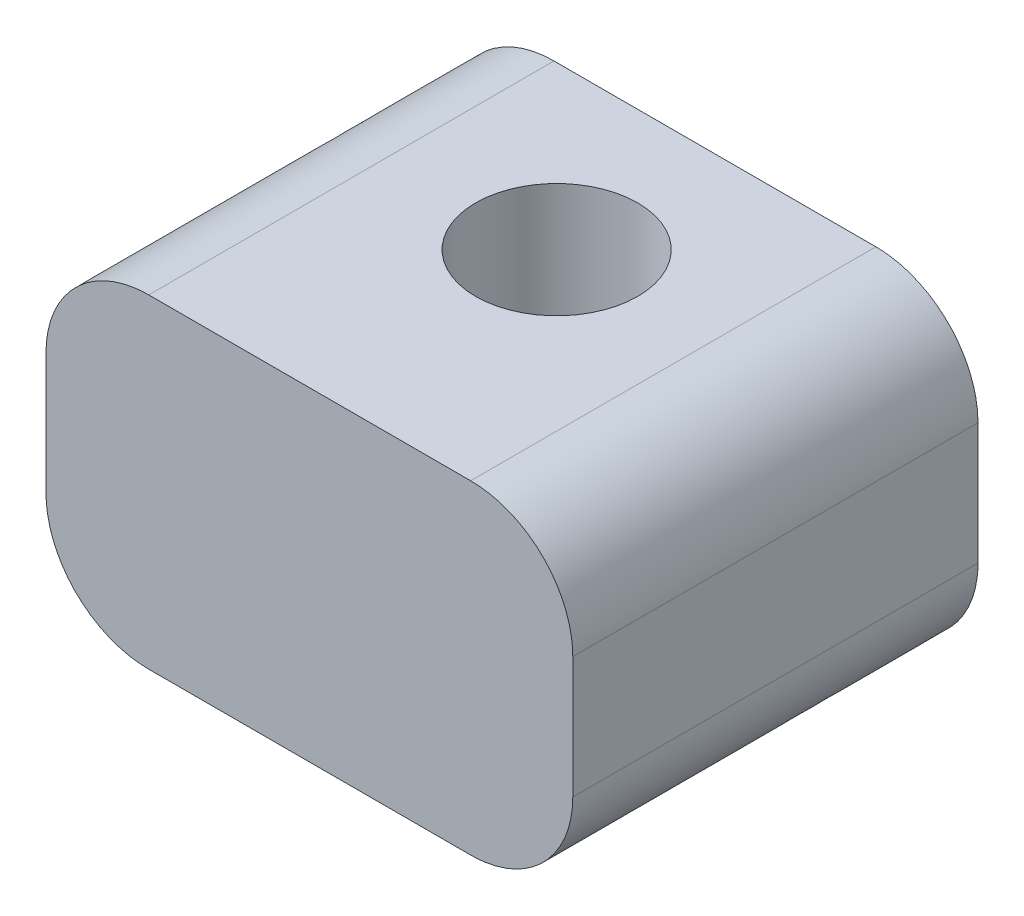
ISO-10303-21;
HEADER;
FILE_DESCRIPTION(('STEP AP214'),'2;1');
FILE_NAME('part.step','',(''),(''),'','','');
FILE_SCHEMA(('AUTOMOTIVE_DESIGN { 1 0 10303 214 1 1 1 1 }'));
ENDSEC;
DATA;
#1=APPLICATION_CONTEXT('core data for automotive mechanical design processes');
#2=APPLICATION_PROTOCOL_DEFINITION('international standard','automotive_design',2000,#1);
#3=PRODUCT_CONTEXT('',#1,'mechanical');
#4=PRODUCT('Part','Part','',(#3));
#5=PRODUCT_RELATED_PRODUCT_CATEGORY('part','',(#4));
#6=PRODUCT_DEFINITION_FORMATION('','',#4);
#7=PRODUCT_DEFINITION_CONTEXT('part definition',#1,'design');
#8=PRODUCT_DEFINITION('design','',#6,#7);
#9=PRODUCT_DEFINITION_SHAPE('','',#8);
#10=(LENGTH_UNIT() NAMED_UNIT(*) SI_UNIT(.MILLI.,.METRE.));
#11=(NAMED_UNIT(*) PLANE_ANGLE_UNIT() SI_UNIT($,.RADIAN.));
#12=(NAMED_UNIT(*) SI_UNIT($,.STERADIAN.) SOLID_ANGLE_UNIT());
#13=UNCERTAINTY_MEASURE_WITH_UNIT(LENGTH_MEASURE(1.E-05),#10,'distance_accuracy_value','');
#14=(GEOMETRIC_REPRESENTATION_CONTEXT(3) GLOBAL_UNCERTAINTY_ASSIGNED_CONTEXT((#13)) GLOBAL_UNIT_ASSIGNED_CONTEXT((#10,
#11,#12)) REPRESENTATION_CONTEXT('',''));
#15=CARTESIAN_POINT('',(0.,0.,0.));
#16=DIRECTION('',(0.,0.,1.));
#17=DIRECTION('',(1.,0.,0.));
#18=AXIS2_PLACEMENT_3D('',#15,#16,#17);
#19=CARTESIAN_POINT('',(56.5738812658112,33.3202913605477,-20.));
#20=DIRECTION('',(0.,0.,-1.));
#21=DIRECTION('',(-1.,0.,0.));
#22=AXIS2_PLACEMENT_3D('',#19,#20,#21);
#23=PLANE('',#22);
#24=CARTESIAN_POINT('',(63.9822359636255,15.6140500568828,-20.));
#25=CARTESIAN_POINT('',(63.9822359636255,17.271310828213,-20.));
#26=CARTESIAN_POINT('',(63.8178066470834,18.9005241730137,-20.));
#27=CARTESIAN_POINT('',(63.3348098147333,21.3040284512323,-20.));
#28=CARTESIAN_POINT('',(63.1341234177272,22.098426881831,-20.));
#29=CARTESIAN_POINT('',(62.6515766195482,23.6733775386782,-20.));
#30=CARTESIAN_POINT('',(62.3685484111371,24.4554634838581,-20.));
#31=CARTESIAN_POINT('',(61.4156169736256,26.7292529878774,-20.));
#32=CARTESIAN_POINT('',(60.6384611396683,28.1665007346257,-20.));
#33=CARTESIAN_POINT('',(59.4914661052539,29.8657846285392,-20.));
#34=CARTESIAN_POINT('',(59.2532102512879,30.200733656794,-20.));
#35=CARTESIAN_POINT('',(58.7587058231767,30.8606615985293,-20.));
#36=CARTESIAN_POINT('',(58.5017101573643,31.1865028630089,-20.));
#37=CARTESIAN_POINT('',(57.710451503924,32.1400971929215,-20.));
#38=CARTESIAN_POINT('',(57.1554727533683,32.7450842260061,-20.));
#39=CARTESIAN_POINT('',(55.4106982906972,34.4707056296308,-20.));
#40=CARTESIAN_POINT('',(54.1418182468829,35.5028439024482,-20.));
#41=CARTESIAN_POINT('',(52.4204896371792,36.6416947413059,-20.));
#42=CARTESIAN_POINT('',(52.0687835451715,36.8621385015597,-20.));
#43=CARTESIAN_POINT('',(51.359150827545,37.2830161996253,-20.));
#44=CARTESIAN_POINT('',(51.0004108497897,37.4840299005005,-20.));
#45=CARTESIAN_POINT('',(49.912631680836,38.059303905822,-20.));
#46=CARTESIAN_POINT('',(48.4314890447793,38.7524205595648,-20.));
#47=CARTESIAN_POINT('',(46.889689035893,39.2998286890547,-20.));
#48=CARTESIAN_POINT('',(45.3171293393522,39.773347223834,-20.));
#49=CARTESIAN_POINT('',(44.5116727126493,39.9737964387616,-20.));
#50=CARTESIAN_POINT('',(42.0810297386303,40.4534788082669,-20.));
#51=CARTESIAN_POINT('',(40.4424434493492,40.6140500568829,-20.));
#52=CARTESIAN_POINT('',(38.7855450768229,40.6140500568828,-20.));
#53=B_SPLINE_CURVE_WITH_KNOTS('',3,(#24,#25,#26,#27,#28,#29,#30,#31,#32,#33,#34,#35,#36,#37,#38,
#39,#40,#41,#42,#43,#44,#45,#46,#47,#48,#49,#50,#51,#52),.UNSPECIFIED.,.F.,.F.,(4,2,2,2,2,2,2,2,
2,2,2,1,2,2,4),(0.,0.124999999999999,0.187499999999999,0.249999999999998,0.374999999999997,
0.406249999999997,0.437499999999997,0.499999999999998,0.625,0.65625,0.687500000000001,0.75,
0.8125,0.875,1.),.UNSPECIFIED.);
#54=CARTESIAN_POINT('',(63.9822359636255,15.6140500568828,-20.));
#55=VERTEX_POINT('',#54);
#56=CARTESIAN_POINT('',(38.7855450768229,40.6140500568828,-20.));
#57=VERTEX_POINT('',#56);
#58=EDGE_CURVE('E292',#55,#57,#53,.T.);
#59=ORIENTED_EDGE('',*,*,#58,.F.);
#60=DIRECTION('',(0.,1.,0.));
#61=VECTOR('',#60,1.);
#62=CARTESIAN_POINT('',(63.9822359636254,-14.3859499431172,-20.));
#63=LINE('',#62,#61);
#64=CARTESIAN_POINT('',(63.9822359636254,-14.3859499431172,-20.));
#65=VERTEX_POINT('',#64);
#66=EDGE_CURVE('E462',#65,#55,#63,.T.);
#67=ORIENTED_EDGE('',*,*,#66,.F.);
#68=CARTESIAN_POINT('',(38.7855450768229,-39.3859499431172,-20.));
#69=CARTESIAN_POINT('',(40.4426640259713,-39.3859499431172,-20.));
#70=CARTESIAN_POINT('',(42.0724777183105,-39.2253548759772,-20.));
#71=CARTESIAN_POINT('',(44.4778779861189,-38.7532012562898,-20.));
#72=CARTESIAN_POINT('',(45.2730764717798,-38.5569895783757,-20.));
#73=CARTESIAN_POINT('',(46.8499677370952,-38.0851328087536,-20.));
#74=CARTESIAN_POINT('',(47.6343883230074,-37.8079762069288,-20.));
#75=CARTESIAN_POINT('',(49.9178071440006,-36.8732982257768,-20.));
#76=CARTESIAN_POINT('',(51.3625444467055,-36.1102920757404,-20.));
#77=CARTESIAN_POINT('',(53.4142819071472,-34.7576552792462,-20.));
#78=CARTESIAN_POINT('',(54.0798992294926,-34.2709789421714,-20.));
#79=CARTESIAN_POINT('',(55.3664022429118,-33.228584654434,-20.));
#80=CARTESIAN_POINT('',(55.978731769579,-32.6799749176984,-20.));
#81=CARTESIAN_POINT('',(57.7258667429109,-30.9544897367587,-20.));
#82=CARTESIAN_POINT('',(58.7716680740673,-29.6987114028121,-20.));
#83=CARTESIAN_POINT('',(60.1577505269511,-27.6531501551703,-20.));
#84=CARTESIAN_POINT('',(60.5896149963003,-26.942198814043,-20.));
#85=CARTESIAN_POINT('',(61.3723446543411,-25.4968404813474,-20.));
#86=CARTESIAN_POINT('',(62.079494347808,-24.0208243414446,-20.));
#87=CARTESIAN_POINT('',(62.6379562510884,-22.484495370869,-20.));
#88=CARTESIAN_POINT('',(63.1211472778569,-20.9176339697291,-20.));
#89=CARTESIAN_POINT('',(63.3256438929064,-20.1161928610094,-20.));
#90=CARTESIAN_POINT('',(63.8177408864177,-17.683150497013,-20.));
#91=CARTESIAN_POINT('',(63.9822359636254,-16.0434409123908,-20.));
#92=CARTESIAN_POINT('',(63.9822359636254,-14.3859499431172,-20.));
#93=B_SPLINE_CURVE_WITH_KNOTS('',3,(#68,#69,#70,#71,#72,#73,#74,#75,#76,#77,#78,#79,#80,#81,#82,
#83,#84,#85,#86,#87,#88,#89,#90,#91,#92),.UNSPECIFIED.,.F.,.F.,(4,2,2,2,2,2,2,2,2,1,2,2,4),(0.,
0.125,0.1875,0.25,0.374999999999999,0.437499999999999,0.499999999999999,0.624999999999999,
0.687499999999999,0.749999999999999,0.812499999999999,0.875,1.),.UNSPECIFIED.);
#94=CARTESIAN_POINT('',(38.7855450768229,-39.3859499431172,-20.));
#95=VERTEX_POINT('',#94);
#96=EDGE_CURVE('E489',#95,#65,#93,.T.);
#97=ORIENTED_EDGE('',*,*,#96,.F.);
#98=DIRECTION('',(1.,0.,0.));
#99=VECTOR('',#98,1.);
#100=CARTESIAN_POINT('',(-40.651735145084,-39.3859499431172,-20.));
#101=LINE('',#100,#99);
#102=CARTESIAN_POINT('',(-40.651735145084,-39.3859499431172,-20.));
#103=VERTEX_POINT('',#102);
#104=EDGE_CURVE('E429',#103,#95,#101,.T.);
#105=ORIENTED_EDGE('',*,*,#104,.F.);
#106=CARTESIAN_POINT('',(-66.0177640363745,-14.3859499431172,-20.));
#107=CARTESIAN_POINT('',(-66.0177640363745,-16.0488761377582,-20.));
#108=CARTESIAN_POINT('',(-65.8510942074984,-17.6833317782563,-20.));
#109=CARTESIAN_POINT('',(-65.3617029758162,-20.0941232189892,-20.));
#110=CARTESIAN_POINT('',(-65.1583734085488,-20.8908535425811,-20.));
#111=CARTESIAN_POINT('',(-64.6695029244137,-22.4702708401332,-20.));
#112=CARTESIAN_POINT('',(-64.3829859642407,-23.2538716869493,-20.));
#113=CARTESIAN_POINT('',(-63.4188612788748,-25.5311481988265,-20.));
#114=CARTESIAN_POINT('',(-62.6329090013717,-26.9699861229455,-20.));
#115=CARTESIAN_POINT('',(-61.4734294800864,-28.6704386943378,-20.));
#116=CARTESIAN_POINT('',(-61.2326012695183,-29.005579947496,-20.));
#117=CARTESIAN_POINT('',(-60.7328018185847,-29.6658096646613,-20.));
#118=CARTESIAN_POINT('',(-60.4732227968187,-29.9915582746293,-20.));
#119=CARTESIAN_POINT('',(-59.6751876814234,-30.943569432468,-20.));
#120=CARTESIAN_POINT('',(-59.1155750956479,-31.5474719428068,-20.));
#121=CARTESIAN_POINT('',(-57.3565618488318,-33.2697557184316,-20.));
#122=CARTESIAN_POINT('',(-56.0777425458619,-34.2995573784712,-20.));
#123=CARTESIAN_POINT('',(-54.3434229358051,-35.4353499241265,-20.));
#124=CARTESIAN_POINT('',(-53.9898577783583,-35.6546845617825,-20.));
#125=CARTESIAN_POINT('',(-53.2767249928466,-36.073359455643,-20.));
#126=CARTESIAN_POINT('',(-52.9162185867473,-36.2733322138507,-20.));
#127=CARTESIAN_POINT('',(-51.8230862293324,-36.8456481878112,-20.));
#128=CARTESIAN_POINT('',(-50.3346621419113,-37.5352585881821,-20.));
#129=CARTESIAN_POINT('',(-48.7852462153652,-38.0799025789934,-20.));
#130=CARTESIAN_POINT('',(-47.2048786901492,-38.5509802994042,-20.));
#131=CARTESIAN_POINT('',(-46.3955757110702,-38.7502724047418,-20.));
#132=CARTESIAN_POINT('',(-43.9576687224027,-39.2264519843911,-20.));
#133=CARTESIAN_POINT('',(-42.3139936756266,-39.3859499431172,-20.));
#134=CARTESIAN_POINT('',(-40.651735145084,-39.3859499431172,-20.));
#135=B_SPLINE_CURVE_WITH_KNOTS('',3,(#106,#107,#108,#109,#110,#111,#112,#113,#114,#115,#116,
#117,#118,#119,#120,#121,#122,#123,#124,#125,#126,#127,#128,#129,#130,#131,#132,#133,#134),
.UNSPECIFIED.,.F.,.F.,(4,2,2,2,2,2,2,2,2,2,2,1,2,2,4),(0.,0.124999999999999,0.187499999999999,
0.249999999999999,0.374999999999998,0.406249999999998,0.437499999999998,0.499999999999998,
0.624999999999998,0.656249999999998,0.687499999999998,0.749999999999998,0.812499999999999,
0.874999999999999,1.),.UNSPECIFIED.);
#136=CARTESIAN_POINT('',(-66.0177640363745,-14.3859499431172,-20.));
#137=VERTEX_POINT('',#136);
#138=EDGE_CURVE('E415',#137,#103,#135,.T.);
#139=ORIENTED_EDGE('',*,*,#138,.F.);
#140=DIRECTION('',(0.,-1.,0.));
#141=VECTOR('',#140,1.);
#142=CARTESIAN_POINT('',(-66.0177640363745,15.6140500568828,-20.));
#143=LINE('',#142,#141);
#144=CARTESIAN_POINT('',(-66.0177640363745,15.6140500568828,-20.));
#145=VERTEX_POINT('',#144);
#146=EDGE_CURVE('E426',#145,#137,#143,.T.);
#147=ORIENTED_EDGE('',*,*,#146,.F.);
#148=CARTESIAN_POINT('',(-40.6517351450841,40.6140500568828,-20.));
#149=CARTESIAN_POINT('',(-42.3144010424557,40.6140500568828,-20.));
#150=CARTESIAN_POINT('',(-43.949970441299,40.4544925384282,-20.));
#151=CARTESIAN_POINT('',(-46.3642811767648,39.9852497260022,-20.));
#152=CARTESIAN_POINT('',(-47.1624966518155,39.7902377429899,-20.));
#153=CARTESIAN_POINT('',(-48.7455171589583,39.3212464890833,-20.));
#154=CARTESIAN_POINT('',(-49.5334606649867,39.045648858986,-20.));
#155=CARTESIAN_POINT('',(-51.8286614238726,38.1154798582432,-20.));
#156=CARTESIAN_POINT('',(-53.2814421723988,37.3558620979099,-20.));
#157=CARTESIAN_POINT('',(-55.3454382460042,36.0087190518263,-20.));
#158=CARTESIAN_POINT('',(-56.0141085866533,35.5248129909125,-20.));
#159=CARTESIAN_POINT('',(-57.3112270913056,34.4844608005817,-20.));
#160=CARTESIAN_POINT('',(-57.9289329656453,33.9366065017031,-20.));
#161=CARTESIAN_POINT('',(-59.6912886407159,32.2135123574416,-20.));
#162=CARTESIAN_POINT('',(-60.7465352168411,30.9590927163904,-20.));
#163=CARTESIAN_POINT('',(-62.1457160673884,28.9152153538707,-20.));
#164=CARTESIAN_POINT('',(-62.5825956794009,28.203507768657,-20.));
#165=CARTESIAN_POINT('',(-63.3749184253428,26.7553127572188,-20.));
#166=CARTESIAN_POINT('',(-63.7327855763939,26.0158636772262,-20.));
#167=CARTESIAN_POINT('',(-64.3732565550017,24.5067935893949,-20.));
#168=CARTESIAN_POINT('',(-64.6558593103506,23.7371721517243,-20.));
#169=CARTESIAN_POINT('',(-65.1449218692305,22.1674047188485,-20.));
#170=CARTESIAN_POINT('',(-65.3517251992064,21.365590427056,-20.));
#171=CARTESIAN_POINT('',(-65.8509862375408,18.9231897433982,-20.));
#172=CARTESIAN_POINT('',(-66.0177640363745,17.2774126007906,-20.));
#173=CARTESIAN_POINT('',(-66.0177640363745,15.6140500568828,-20.));
#174=B_SPLINE_CURVE_WITH_KNOTS('',3,(#148,#149,#150,#151,#152,#153,#154,#155,#156,#157,#158,
#159,#160,#161,#162,#163,#164,#165,#166,#167,#168,#169,#170,#171,#172,#173),.UNSPECIFIED.,.F.,
.F.,(4,2,2,2,2,2,2,2,2,2,2,2,4),(0.,0.124999999999999,0.187499999999999,0.249999999999999,0.375,
0.4375,0.5,0.624999999999999,0.687499999999999,0.749999999999999,0.8125,0.875,1.),.UNSPECIFIED.);
#175=CARTESIAN_POINT('',(-40.6517351450841,40.6140500568828,-20.));
#176=VERTEX_POINT('',#175);
#177=EDGE_CURVE('E291',#176,#145,#174,.T.);
#178=ORIENTED_EDGE('',*,*,#177,.F.);
#179=DIRECTION('',(-1.,0.,0.));
#180=VECTOR('',#179,1.);
#181=CARTESIAN_POINT('',(38.7855450768229,40.6140500568828,-20.));
#182=LINE('',#181,#180);
#183=EDGE_CURVE('E288',#57,#176,#182,.T.);
#184=ORIENTED_EDGE('',*,*,#183,.F.);
#185=EDGE_LOOP('',(#59,#67,#97,#105,#139,#147,#178,#184));
#186=FACE_BOUND('',#185,.T.);
#187=DIRECTION('',(-1.,0.,0.));
#188=VECTOR('',#187,1.);
#189=CARTESIAN_POINT('',(-50.4848959127018,-8.27388536757137,-20.));
#190=LINE('',#189,#188);
#191=CARTESIAN_POINT('',(49.5151040872982,-8.27388536757138,-20.));
#192=VERTEX_POINT('',#191);
#193=CARTESIAN_POINT('',(-50.4848959127018,-8.27388536757137,-20.));
#194=VERTEX_POINT('',#193);
#195=EDGE_CURVE('E146',#192,#194,#190,.T.);
#196=ORIENTED_EDGE('',*,*,#195,.F.);
#197=DIRECTION('',(0.,-1.,0.));
#198=VECTOR('',#197,1.);
#199=CARTESIAN_POINT('',(49.5151040872982,-8.27388536757138,-20.));
#200=LINE('',#199,#198);
#201=CARTESIAN_POINT('',(49.5151040872982,7.72611463242862,-20.));
#202=VERTEX_POINT('',#201);
#203=EDGE_CURVE('E138',#202,#192,#200,.T.);
#204=ORIENTED_EDGE('',*,*,#203,.F.);
#205=DIRECTION('',(1.,0.,0.));
#206=VECTOR('',#205,1.);
#207=CARTESIAN_POINT('',(-50.4848959127018,7.72611463242863,-20.));
#208=LINE('',#207,#206);
#209=CARTESIAN_POINT('',(-50.4848959127018,7.72611463242863,-20.));
#210=VERTEX_POINT('',#209);
#211=EDGE_CURVE('E162',#210,#202,#208,.T.);
#212=ORIENTED_EDGE('',*,*,#211,.F.);
#213=DIRECTION('',(0.,1.,0.));
#214=VECTOR('',#213,1.);
#215=CARTESIAN_POINT('',(-50.4848959127018,-8.27388536757137,-20.));
#216=LINE('',#215,#214);
#217=EDGE_CURVE('E160',#194,#210,#216,.T.);
#218=ORIENTED_EDGE('',*,*,#217,.F.);
#219=EDGE_LOOP('',(#196,#204,#212,#218));
#220=FACE_BOUND('',#219,.T.);
#221=ADVANCED_FACE('F37',(#186,#220),#23,.T.);
#222=CARTESIAN_POINT('',(63.9822359636255,15.6140500568828,-20.));
#223=CARTESIAN_POINT('',(63.9822359636255,17.271310828213,-20.));
#224=CARTESIAN_POINT('',(63.8178066470834,18.9005241730137,-20.));
#225=CARTESIAN_POINT('',(63.3348098147333,21.3040284512323,-20.));
#226=CARTESIAN_POINT('',(63.1341234177272,22.098426881831,-20.));
#227=CARTESIAN_POINT('',(62.6515766195482,23.6733775386782,-20.));
#228=CARTESIAN_POINT('',(62.3685484111371,24.4554634838581,-20.));
#229=CARTESIAN_POINT('',(61.4156169736256,26.7292529878774,-20.));
#230=CARTESIAN_POINT('',(60.6384611396683,28.1665007346257,-20.));
#231=CARTESIAN_POINT('',(59.4914661052539,29.8657846285392,-20.));
#232=CARTESIAN_POINT('',(59.2532102512879,30.200733656794,-20.));
#233=CARTESIAN_POINT('',(58.7587058231767,30.8606615985293,-20.));
#234=CARTESIAN_POINT('',(58.5017101573643,31.1865028630089,-20.));
#235=CARTESIAN_POINT('',(57.710451503924,32.1400971929215,-20.));
#236=CARTESIAN_POINT('',(57.1554727533683,32.7450842260061,-20.));
#237=CARTESIAN_POINT('',(55.4106982906972,34.4707056296308,-20.));
#238=CARTESIAN_POINT('',(54.1418182468829,35.5028439024482,-20.));
#239=CARTESIAN_POINT('',(52.4204896371792,36.6416947413059,-20.));
#240=CARTESIAN_POINT('',(52.0687835451715,36.8621385015597,-20.));
#241=CARTESIAN_POINT('',(51.359150827545,37.2830161996253,-20.));
#242=CARTESIAN_POINT('',(51.0004108497897,37.4840299005005,-20.));
#243=CARTESIAN_POINT('',(49.912631680836,38.059303905822,-20.));
#244=CARTESIAN_POINT('',(48.4314890447793,38.7524205595648,-20.));
#245=CARTESIAN_POINT('',(46.889689035893,39.2998286890547,-20.));
#246=CARTESIAN_POINT('',(45.3171293393522,39.773347223834,-20.));
#247=CARTESIAN_POINT('',(44.5116727126493,39.9737964387616,-20.));
#248=CARTESIAN_POINT('',(42.0810297386303,40.4534788082669,-20.));
#249=CARTESIAN_POINT('',(40.4424434493492,40.6140500568829,-20.));
#250=CARTESIAN_POINT('',(38.7855450768229,40.6140500568828,-20.));
#251=B_SPLINE_CURVE_WITH_KNOTS('',3,(#222,#223,#224,#225,#226,#227,#228,#229,#230,#231,#232,
#233,#234,#235,#236,#237,#238,#239,#240,#241,#242,#243,#244,#245,#246,#247,#248,#249,#250),
.UNSPECIFIED.,.F.,.F.,(4,2,2,2,2,2,2,2,2,2,2,1,2,2,4),(0.,0.124999999999999,0.187499999999999,
0.249999999999998,0.374999999999997,0.406249999999997,0.437499999999997,0.499999999999998,0.625,
0.65625,0.687500000000001,0.75,0.8125,0.875,1.),.UNSPECIFIED.);
#252=DIRECTION('',(0.,0.,1.));
#253=VECTOR('',#252,1.);
#254=SURFACE_OF_LINEAR_EXTRUSION('',#251,#253);
#255=CARTESIAN_POINT('',(38.7855450768229,40.6140500568828,80.));
#256=CARTESIAN_POINT('',(40.4424434493492,40.6140500568829,80.));
#257=CARTESIAN_POINT('',(42.0810297386303,40.4534788082669,80.));
#258=CARTESIAN_POINT('',(44.5116727126493,39.9737964387616,80.));
#259=CARTESIAN_POINT('',(45.3171293393522,39.773347223834,80.));
#260=CARTESIAN_POINT('',(46.889689035893,39.2998286890547,80.));
#261=CARTESIAN_POINT('',(48.4314890447793,38.7524205595648,80.));
#262=CARTESIAN_POINT('',(49.912631680836,38.059303905822,80.));
#263=CARTESIAN_POINT('',(51.0004108497897,37.4840299005005,80.));
#264=CARTESIAN_POINT('',(51.359150827545,37.2830161996253,80.));
#265=CARTESIAN_POINT('',(52.0687835451715,36.8621385015597,80.));
#266=CARTESIAN_POINT('',(52.4204896371792,36.6416947413059,80.));
#267=CARTESIAN_POINT('',(54.1418182468829,35.5028439024482,80.));
#268=CARTESIAN_POINT('',(55.4106982906972,34.4707056296308,80.));
#269=CARTESIAN_POINT('',(57.1554727533683,32.7450842260061,80.));
#270=CARTESIAN_POINT('',(57.710451503924,32.1400971929215,80.));
#271=CARTESIAN_POINT('',(58.5017101573643,31.1865028630089,80.));
#272=CARTESIAN_POINT('',(58.7587058231767,30.8606615985293,80.));
#273=CARTESIAN_POINT('',(59.2532102512879,30.200733656794,80.));
#274=CARTESIAN_POINT('',(59.4914661052539,29.8657846285392,80.));
#275=CARTESIAN_POINT('',(60.6384611396683,28.1665007346257,80.));
#276=CARTESIAN_POINT('',(61.4156169736256,26.7292529878774,80.));
#277=CARTESIAN_POINT('',(62.3685484111371,24.4554634838581,80.));
#278=CARTESIAN_POINT('',(62.6515766195482,23.6733775386782,80.));
#279=CARTESIAN_POINT('',(63.1341234177272,22.098426881831,80.));
#280=CARTESIAN_POINT('',(63.3348098147333,21.3040284512323,80.));
#281=CARTESIAN_POINT('',(63.8178066470834,18.9005241730137,80.));
#282=CARTESIAN_POINT('',(63.9822359636255,17.271310828213,80.));
#283=CARTESIAN_POINT('',(63.9822359636255,15.6140500568828,80.));
#284=B_SPLINE_CURVE_WITH_KNOTS('',3,(#255,#256,#257,#258,#259,#260,#261,#262,#263,#264,#265,
#266,#267,#268,#269,#270,#271,#272,#273,#274,#275,#276,#277,#278,#279,#280,#281,#282,#283),
.UNSPECIFIED.,.F.,.F.,(4,2,2,1,2,2,2,2,2,2,2,2,2,2,4),(0.,0.125,0.1875,0.25,0.312499999999999,
0.34375,0.375,0.500000000000002,0.562500000000003,0.593750000000003,0.625000000000003,
0.750000000000002,0.812500000000001,0.875000000000001,1.),.UNSPECIFIED.);
#285=CARTESIAN_POINT('',(63.9822359636255,15.6140500568828,80.));
#286=VERTEX_POINT('',#285);
#287=CARTESIAN_POINT('',(38.7855450768229,40.6140500568828,80.));
#288=VERTEX_POINT('',#287);
#289=EDGE_CURVE('E155',#286,#288,#284,.F.);
#290=ORIENTED_EDGE('',*,*,#289,.F.);
#291=DIRECTION('',(0.,0.,1.));
#292=VECTOR('',#291,1.);
#293=CARTESIAN_POINT('',(63.9822359636255,15.6140500568828,-20.));
#294=LINE('',#293,#292);
#295=EDGE_CURVE('E220',#55,#286,#294,.T.);
#296=ORIENTED_EDGE('',*,*,#295,.F.);
#297=ORIENTED_EDGE('',*,*,#58,.T.);
#298=DIRECTION('',(0.,0.,1.));
#299=VECTOR('',#298,1.);
#300=CARTESIAN_POINT('',(38.7855450768229,40.6140500568828,-20.));
#301=LINE('',#300,#299);
#302=EDGE_CURVE('E285',#57,#288,#301,.T.);
#303=ORIENTED_EDGE('',*,*,#302,.T.);
#304=EDGE_LOOP('',(#290,#296,#297,#303));
#305=FACE_BOUND('',#304,.T.);
#306=ADVANCED_FACE('F189',(#305),#254,.T.);
#307=CARTESIAN_POINT('',(63.9822359636254,-14.3859499431172,-20.));
#308=DIRECTION('',(1.,0.,0.));
#309=DIRECTION('',(0.,1.,0.));
#310=AXIS2_PLACEMENT_3D('',#307,#308,#309);
#311=PLANE('',#310);
#312=DIRECTION('',(0.,1.,0.));
#313=VECTOR('',#312,1.);
#314=CARTESIAN_POINT('',(63.9822359636254,-14.3859499431172,80.));
#315=LINE('',#314,#313);
#316=CARTESIAN_POINT('',(63.9822359636254,-14.3859499431172,80.));
#317=VERTEX_POINT('',#316);
#318=EDGE_CURVE('E408',#317,#286,#315,.T.);
#319=ORIENTED_EDGE('',*,*,#318,.F.);
#320=DIRECTION('',(0.,0.,1.));
#321=VECTOR('',#320,1.);
#322=CARTESIAN_POINT('',(63.9822359636254,-14.3859499431172,-20.));
#323=LINE('',#322,#321);
#324=EDGE_CURVE('E455',#65,#317,#323,.T.);
#325=ORIENTED_EDGE('',*,*,#324,.F.);
#326=ORIENTED_EDGE('',*,*,#66,.T.);
#327=ORIENTED_EDGE('',*,*,#295,.T.);
#328=EDGE_LOOP('',(#319,#325,#326,#327));
#329=FACE_BOUND('',#328,.T.);
#330=ADVANCED_FACE('F193',(#329),#311,.T.);
#331=CARTESIAN_POINT('',(38.7855450768229,-39.3859499431172,-20.));
#332=CARTESIAN_POINT('',(40.4426640259713,-39.3859499431172,-20.));
#333=CARTESIAN_POINT('',(42.0724777183105,-39.2253548759772,-20.));
#334=CARTESIAN_POINT('',(44.4778779861189,-38.7532012562898,-20.));
#335=CARTESIAN_POINT('',(45.2730764717798,-38.5569895783757,-20.));
#336=CARTESIAN_POINT('',(46.8499677370952,-38.0851328087536,-20.));
#337=CARTESIAN_POINT('',(47.6343883230074,-37.8079762069288,-20.));
#338=CARTESIAN_POINT('',(49.9178071440006,-36.8732982257768,-20.));
#339=CARTESIAN_POINT('',(51.3625444467055,-36.1102920757404,-20.));
#340=CARTESIAN_POINT('',(53.4142819071472,-34.7576552792462,-20.));
#341=CARTESIAN_POINT('',(54.0798992294926,-34.2709789421714,-20.));
#342=CARTESIAN_POINT('',(55.3664022429118,-33.228584654434,-20.));
#343=CARTESIAN_POINT('',(55.978731769579,-32.6799749176984,-20.));
#344=CARTESIAN_POINT('',(57.7258667429109,-30.9544897367587,-20.));
#345=CARTESIAN_POINT('',(58.7716680740673,-29.6987114028121,-20.));
#346=CARTESIAN_POINT('',(60.1577505269511,-27.6531501551703,-20.));
#347=CARTESIAN_POINT('',(60.5896149963003,-26.942198814043,-20.));
#348=CARTESIAN_POINT('',(61.3723446543411,-25.4968404813474,-20.));
#349=CARTESIAN_POINT('',(62.079494347808,-24.0208243414446,-20.));
#350=CARTESIAN_POINT('',(62.6379562510884,-22.484495370869,-20.));
#351=CARTESIAN_POINT('',(63.1211472778569,-20.9176339697291,-20.));
#352=CARTESIAN_POINT('',(63.3256438929064,-20.1161928610094,-20.));
#353=CARTESIAN_POINT('',(63.8177408864177,-17.683150497013,-20.));
#354=CARTESIAN_POINT('',(63.9822359636254,-16.0434409123908,-20.));
#355=CARTESIAN_POINT('',(63.9822359636254,-14.3859499431172,-20.));
#356=B_SPLINE_CURVE_WITH_KNOTS('',3,(#331,#332,#333,#334,#335,#336,#337,#338,#339,#340,#341,
#342,#343,#344,#345,#346,#347,#348,#349,#350,#351,#352,#353,#354,#355),.UNSPECIFIED.,.F.,.F.,(4,
2,2,2,2,2,2,2,2,1,2,2,4),(0.,0.125,0.1875,0.25,0.374999999999999,0.437499999999999,
0.499999999999999,0.624999999999999,0.687499999999999,0.749999999999999,0.812499999999999,0.875,
1.),.UNSPECIFIED.);
#357=DIRECTION('',(0.,0.,1.));
#358=VECTOR('',#357,1.);
#359=SURFACE_OF_LINEAR_EXTRUSION('',#356,#358);
#360=CARTESIAN_POINT('',(63.9822359636254,-14.3859499431172,80.));
#361=CARTESIAN_POINT('',(63.9822359636254,-16.0434409123908,80.));
#362=CARTESIAN_POINT('',(63.8177408864177,-17.683150497013,80.));
#363=CARTESIAN_POINT('',(63.3256438929064,-20.1161928610094,80.));
#364=CARTESIAN_POINT('',(63.1211472778569,-20.9176339697291,80.));
#365=CARTESIAN_POINT('',(62.6379562510884,-22.484495370869,80.));
#366=CARTESIAN_POINT('',(62.079494347808,-24.0208243414446,80.));
#367=CARTESIAN_POINT('',(61.3723446543411,-25.4968404813474,80.));
#368=CARTESIAN_POINT('',(60.5896149963003,-26.942198814043,80.));
#369=CARTESIAN_POINT('',(60.1577505269511,-27.6531501551703,80.));
#370=CARTESIAN_POINT('',(58.7716680740673,-29.6987114028121,80.));
#371=CARTESIAN_POINT('',(57.7258667429109,-30.9544897367587,80.));
#372=CARTESIAN_POINT('',(55.978731769579,-32.6799749176984,80.));
#373=CARTESIAN_POINT('',(55.3664022429118,-33.228584654434,80.));
#374=CARTESIAN_POINT('',(54.0798992294926,-34.2709789421714,80.));
#375=CARTESIAN_POINT('',(53.4142819071472,-34.7576552792462,80.));
#376=CARTESIAN_POINT('',(51.3625444467055,-36.1102920757404,80.));
#377=CARTESIAN_POINT('',(49.9178071440006,-36.8732982257768,80.));
#378=CARTESIAN_POINT('',(47.6343883230074,-37.8079762069288,80.));
#379=CARTESIAN_POINT('',(46.8499677370952,-38.0851328087536,80.));
#380=CARTESIAN_POINT('',(45.2730764717798,-38.5569895783757,80.));
#381=CARTESIAN_POINT('',(44.4778779861189,-38.7532012562898,80.));
#382=CARTESIAN_POINT('',(42.0724777183105,-39.2253548759772,80.));
#383=CARTESIAN_POINT('',(40.4426640259713,-39.3859499431172,80.));
#384=CARTESIAN_POINT('',(38.7855450768229,-39.3859499431172,80.));
#385=B_SPLINE_CURVE_WITH_KNOTS('',3,(#360,#361,#362,#363,#364,#365,#366,#367,#368,#369,#370,
#371,#372,#373,#374,#375,#376,#377,#378,#379,#380,#381,#382,#383,#384),.UNSPECIFIED.,.F.,.F.,(4,
2,2,1,2,2,2,2,2,2,2,2,4),(0.,0.125,0.187500000000001,0.250000000000001,0.312500000000001,
0.375000000000001,0.500000000000001,0.562500000000001,0.625000000000001,0.75,0.8125,0.875,1.),.UNSPECIFIED.);
#386=CARTESIAN_POINT('',(38.7855450768229,-39.3859499431172,80.));
#387=VERTEX_POINT('',#386);
#388=EDGE_CURVE('E405',#387,#317,#385,.F.);
#389=ORIENTED_EDGE('',*,*,#388,.F.);
#390=DIRECTION('',(0.,0.,1.));
#391=VECTOR('',#390,1.);
#392=CARTESIAN_POINT('',(38.7855450768229,-39.3859499431172,-20.));
#393=LINE('',#392,#391);
#394=EDGE_CURVE('E440',#95,#387,#393,.T.);
#395=ORIENTED_EDGE('',*,*,#394,.F.);
#396=ORIENTED_EDGE('',*,*,#96,.T.);
#397=ORIENTED_EDGE('',*,*,#324,.T.);
#398=EDGE_LOOP('',(#389,#395,#396,#397));
#399=FACE_BOUND('',#398,.T.);
#400=ADVANCED_FACE('F383',(#399),#359,.T.);
#401=CARTESIAN_POINT('',(-40.651735145084,-39.3859499431172,-20.));
#402=DIRECTION('',(0.,-1.,0.));
#403=DIRECTION('',(0.,0.,-1.));
#404=AXIS2_PLACEMENT_3D('',#401,#402,#403);
#405=PLANE('',#404);
#406=CARTESIAN_POINT('',(0.,-39.3859499431172,20.));
#407=DIRECTION('',(0.,-1.,0.));
#408=DIRECTION('',(0.,0.,-1.));
#409=AXIS2_PLACEMENT_3D('',#406,#407,#408);
#410=CIRCLE('',#409,20.);
#411=CARTESIAN_POINT('',(0.,-39.3859499431172,0.));
#412=VERTEX_POINT('',#411);
#413=EDGE_CURVE('E512',#412,#412,#410,.T.);
#414=ORIENTED_EDGE('',*,*,#413,.F.);
#415=EDGE_LOOP('',(#414));
#416=FACE_BOUND('',#415,.T.);
#417=DIRECTION('',(1.,0.,0.));
#418=VECTOR('',#417,1.);
#419=CARTESIAN_POINT('',(-40.651735145084,-39.3859499431172,80.));
#420=LINE('',#419,#418);
#421=CARTESIAN_POINT('',(-40.651735145084,-39.3859499431172,80.));
#422=VERTEX_POINT('',#421);
#423=EDGE_CURVE('E397',#422,#387,#420,.T.);
#424=ORIENTED_EDGE('',*,*,#423,.F.);
#425=DIRECTION('',(0.,0.,1.));
#426=VECTOR('',#425,1.);
#427=CARTESIAN_POINT('',(-40.651735145084,-39.3859499431172,-20.));
#428=LINE('',#427,#426);
#429=EDGE_CURVE('E438',#103,#422,#428,.T.);
#430=ORIENTED_EDGE('',*,*,#429,.F.);
#431=ORIENTED_EDGE('',*,*,#104,.T.);
#432=ORIENTED_EDGE('',*,*,#394,.T.);
#433=EDGE_LOOP('',(#424,#430,#431,#432));
#434=FACE_BOUND('',#433,.T.);
#435=ADVANCED_FACE('F362',(#416,#434),#405,.T.);
#436=CARTESIAN_POINT('',(-66.0177640363745,-14.3859499431172,-20.));
#437=CARTESIAN_POINT('',(-66.0177640363745,-16.0488761377582,-20.));
#438=CARTESIAN_POINT('',(-65.8510942074984,-17.6833317782563,-20.));
#439=CARTESIAN_POINT('',(-65.3617029758162,-20.0941232189892,-20.));
#440=CARTESIAN_POINT('',(-65.1583734085488,-20.8908535425811,-20.));
#441=CARTESIAN_POINT('',(-64.6695029244137,-22.4702708401332,-20.));
#442=CARTESIAN_POINT('',(-64.3829859642407,-23.2538716869493,-20.));
#443=CARTESIAN_POINT('',(-63.4188612788748,-25.5311481988265,-20.));
#444=CARTESIAN_POINT('',(-62.6329090013717,-26.9699861229455,-20.));
#445=CARTESIAN_POINT('',(-61.4734294800864,-28.6704386943378,-20.));
#446=CARTESIAN_POINT('',(-61.2326012695183,-29.005579947496,-20.));
#447=CARTESIAN_POINT('',(-60.7328018185847,-29.6658096646613,-20.));
#448=CARTESIAN_POINT('',(-60.4732227968187,-29.9915582746293,-20.));
#449=CARTESIAN_POINT('',(-59.6751876814234,-30.943569432468,-20.));
#450=CARTESIAN_POINT('',(-59.1155750956479,-31.5474719428068,-20.));
#451=CARTESIAN_POINT('',(-57.3565618488318,-33.2697557184316,-20.));
#452=CARTESIAN_POINT('',(-56.0777425458619,-34.2995573784712,-20.));
#453=CARTESIAN_POINT('',(-54.3434229358051,-35.4353499241265,-20.));
#454=CARTESIAN_POINT('',(-53.9898577783583,-35.6546845617825,-20.));
#455=CARTESIAN_POINT('',(-53.2767249928466,-36.073359455643,-20.));
#456=CARTESIAN_POINT('',(-52.9162185867473,-36.2733322138507,-20.));
#457=CARTESIAN_POINT('',(-51.8230862293324,-36.8456481878112,-20.));
#458=CARTESIAN_POINT('',(-50.3346621419113,-37.5352585881821,-20.));
#459=CARTESIAN_POINT('',(-48.7852462153652,-38.0799025789934,-20.));
#460=CARTESIAN_POINT('',(-47.2048786901492,-38.5509802994042,-20.));
#461=CARTESIAN_POINT('',(-46.3955757110702,-38.7502724047418,-20.));
#462=CARTESIAN_POINT('',(-43.9576687224027,-39.2264519843911,-20.));
#463=CARTESIAN_POINT('',(-42.3139936756266,-39.3859499431172,-20.));
#464=CARTESIAN_POINT('',(-40.651735145084,-39.3859499431172,-20.));
#465=B_SPLINE_CURVE_WITH_KNOTS('',3,(#436,#437,#438,#439,#440,#441,#442,#443,#444,#445,#446,
#447,#448,#449,#450,#451,#452,#453,#454,#455,#456,#457,#458,#459,#460,#461,#462,#463,#464),
.UNSPECIFIED.,.F.,.F.,(4,2,2,2,2,2,2,2,2,2,2,1,2,2,4),(0.,0.124999999999999,0.187499999999999,
0.249999999999999,0.374999999999998,0.406249999999998,0.437499999999998,0.499999999999998,
0.624999999999998,0.656249999999998,0.687499999999998,0.749999999999998,0.812499999999999,
0.874999999999999,1.),.UNSPECIFIED.);
#466=DIRECTION('',(0.,0.,1.));
#467=VECTOR('',#466,1.);
#468=SURFACE_OF_LINEAR_EXTRUSION('',#465,#467);
#469=CARTESIAN_POINT('',(-40.651735145084,-39.3859499431172,80.));
#470=CARTESIAN_POINT('',(-42.3139936756266,-39.3859499431172,80.));
#471=CARTESIAN_POINT('',(-43.9576687224027,-39.2264519843911,80.));
#472=CARTESIAN_POINT('',(-46.3955757110702,-38.7502724047418,80.));
#473=CARTESIAN_POINT('',(-47.2048786901492,-38.5509802994042,80.));
#474=CARTESIAN_POINT('',(-48.7852462153652,-38.0799025789934,80.));
#475=CARTESIAN_POINT('',(-50.3346621419113,-37.5352585881821,80.));
#476=CARTESIAN_POINT('',(-51.8230862293324,-36.8456481878112,80.));
#477=CARTESIAN_POINT('',(-52.9162185867473,-36.2733322138507,80.));
#478=CARTESIAN_POINT('',(-53.2767249928466,-36.073359455643,80.));
#479=CARTESIAN_POINT('',(-53.9898577783583,-35.6546845617825,80.));
#480=CARTESIAN_POINT('',(-54.3434229358051,-35.4353499241265,80.));
#481=CARTESIAN_POINT('',(-56.0777425458619,-34.2995573784712,80.));
#482=CARTESIAN_POINT('',(-57.3565618488318,-33.2697557184316,80.));
#483=CARTESIAN_POINT('',(-59.1155750956479,-31.5474719428068,80.));
#484=CARTESIAN_POINT('',(-59.6751876814234,-30.943569432468,80.));
#485=CARTESIAN_POINT('',(-60.4732227968187,-29.9915582746293,80.));
#486=CARTESIAN_POINT('',(-60.7328018185847,-29.6658096646613,80.));
#487=CARTESIAN_POINT('',(-61.2326012695183,-29.005579947496,80.));
#488=CARTESIAN_POINT('',(-61.4734294800864,-28.6704386943378,80.));
#489=CARTESIAN_POINT('',(-62.6329090013717,-26.9699861229455,80.));
#490=CARTESIAN_POINT('',(-63.4188612788748,-25.5311481988265,80.));
#491=CARTESIAN_POINT('',(-64.3829859642407,-23.2538716869493,80.));
#492=CARTESIAN_POINT('',(-64.6695029244137,-22.4702708401332,80.));
#493=CARTESIAN_POINT('',(-65.1583734085488,-20.8908535425811,80.));
#494=CARTESIAN_POINT('',(-65.3617029758162,-20.0941232189892,80.));
#495=CARTESIAN_POINT('',(-65.8510942074984,-17.6833317782563,80.));
#496=CARTESIAN_POINT('',(-66.0177640363745,-16.0488761377582,80.));
#497=CARTESIAN_POINT('',(-66.0177640363745,-14.3859499431172,80.));
#498=B_SPLINE_CURVE_WITH_KNOTS('',3,(#469,#470,#471,#472,#473,#474,#475,#476,#477,#478,#479,
#480,#481,#482,#483,#484,#485,#486,#487,#488,#489,#490,#491,#492,#493,#494,#495,#496,#497),
.UNSPECIFIED.,.F.,.F.,(4,2,2,1,2,2,2,2,2,2,2,2,2,2,4),(0.,0.125000000000001,0.187500000000001,
0.250000000000002,0.312500000000002,0.343750000000002,0.375000000000002,0.500000000000002,
0.562500000000002,0.593750000000002,0.625000000000002,0.750000000000001,0.812500000000001,
0.875000000000001,1.),.UNSPECIFIED.);
#499=CARTESIAN_POINT('',(-66.0177640363745,-14.3859499431172,80.));
#500=VERTEX_POINT('',#499);
#501=EDGE_CURVE('E347',#500,#422,#498,.F.);
#502=ORIENTED_EDGE('',*,*,#501,.F.);
#503=DIRECTION('',(0.,0.,1.));
#504=VECTOR('',#503,1.);
#505=CARTESIAN_POINT('',(-66.0177640363745,-14.3859499431172,-20.));
#506=LINE('',#505,#504);
#507=EDGE_CURVE('E296',#137,#500,#506,.T.);
#508=ORIENTED_EDGE('',*,*,#507,.F.);
#509=ORIENTED_EDGE('',*,*,#138,.T.);
#510=ORIENTED_EDGE('',*,*,#429,.T.);
#511=EDGE_LOOP('',(#502,#508,#509,#510));
#512=FACE_BOUND('',#511,.T.);
#513=ADVANCED_FACE('F353',(#512),#468,.T.);
#514=CARTESIAN_POINT('',(-66.0177640363745,15.6140500568828,-20.));
#515=DIRECTION('',(-1.,0.,0.));
#516=DIRECTION('',(0.,0.,1.));
#517=AXIS2_PLACEMENT_3D('',#514,#515,#516);
#518=PLANE('',#517);
#519=DIRECTION('',(0.,-1.,0.));
#520=VECTOR('',#519,1.);
#521=CARTESIAN_POINT('',(-66.0177640363745,15.6140500568828,80.));
#522=LINE('',#521,#520);
#523=CARTESIAN_POINT('',(-66.0177640363745,15.6140500568828,80.));
#524=VERTEX_POINT('',#523);
#525=EDGE_CURVE('E345',#524,#500,#522,.T.);
#526=ORIENTED_EDGE('',*,*,#525,.F.);
#527=DIRECTION('',(0.,0.,1.));
#528=VECTOR('',#527,1.);
#529=CARTESIAN_POINT('',(-66.0177640363745,15.6140500568828,-20.));
#530=LINE('',#529,#528);
#531=EDGE_CURVE('E284',#145,#524,#530,.T.);
#532=ORIENTED_EDGE('',*,*,#531,.F.);
#533=ORIENTED_EDGE('',*,*,#146,.T.);
#534=ORIENTED_EDGE('',*,*,#507,.T.);
#535=EDGE_LOOP('',(#526,#532,#533,#534));
#536=FACE_BOUND('',#535,.T.);
#537=ADVANCED_FACE('F330',(#536),#518,.T.);
#538=CARTESIAN_POINT('',(-40.6517351450841,40.6140500568828,-20.));
#539=CARTESIAN_POINT('',(-42.3144010424557,40.6140500568828,-20.));
#540=CARTESIAN_POINT('',(-43.949970441299,40.4544925384282,-20.));
#541=CARTESIAN_POINT('',(-46.3642811767648,39.9852497260022,-20.));
#542=CARTESIAN_POINT('',(-47.1624966518155,39.7902377429899,-20.));
#543=CARTESIAN_POINT('',(-48.7455171589583,39.3212464890833,-20.));
#544=CARTESIAN_POINT('',(-49.5334606649867,39.045648858986,-20.));
#545=CARTESIAN_POINT('',(-51.8286614238726,38.1154798582432,-20.));
#546=CARTESIAN_POINT('',(-53.2814421723988,37.3558620979099,-20.));
#547=CARTESIAN_POINT('',(-55.3454382460042,36.0087190518263,-20.));
#548=CARTESIAN_POINT('',(-56.0141085866533,35.5248129909125,-20.));
#549=CARTESIAN_POINT('',(-57.3112270913056,34.4844608005817,-20.));
#550=CARTESIAN_POINT('',(-57.9289329656453,33.9366065017031,-20.));
#551=CARTESIAN_POINT('',(-59.6912886407159,32.2135123574416,-20.));
#552=CARTESIAN_POINT('',(-60.7465352168411,30.9590927163904,-20.));
#553=CARTESIAN_POINT('',(-62.1457160673884,28.9152153538707,-20.));
#554=CARTESIAN_POINT('',(-62.5825956794009,28.203507768657,-20.));
#555=CARTESIAN_POINT('',(-63.3749184253428,26.7553127572188,-20.));
#556=CARTESIAN_POINT('',(-63.7327855763939,26.0158636772262,-20.));
#557=CARTESIAN_POINT('',(-64.3732565550017,24.5067935893949,-20.));
#558=CARTESIAN_POINT('',(-64.6558593103506,23.7371721517243,-20.));
#559=CARTESIAN_POINT('',(-65.1449218692305,22.1674047188485,-20.));
#560=CARTESIAN_POINT('',(-65.3517251992064,21.365590427056,-20.));
#561=CARTESIAN_POINT('',(-65.8509862375408,18.9231897433982,-20.));
#562=CARTESIAN_POINT('',(-66.0177640363745,17.2774126007906,-20.));
#563=CARTESIAN_POINT('',(-66.0177640363745,15.6140500568828,-20.));
#564=B_SPLINE_CURVE_WITH_KNOTS('',3,(#538,#539,#540,#541,#542,#543,#544,#545,#546,#547,#548,
#549,#550,#551,#552,#553,#554,#555,#556,#557,#558,#559,#560,#561,#562,#563),.UNSPECIFIED.,.F.,
.F.,(4,2,2,2,2,2,2,2,2,2,2,2,4),(0.,0.124999999999999,0.187499999999999,0.249999999999999,0.375,
0.4375,0.5,0.624999999999999,0.687499999999999,0.749999999999999,0.8125,0.875,1.),.UNSPECIFIED.);
#565=DIRECTION('',(0.,0.,1.));
#566=VECTOR('',#565,1.);
#567=SURFACE_OF_LINEAR_EXTRUSION('',#564,#566);
#568=CARTESIAN_POINT('',(-66.0177640363745,15.6140500568828,80.));
#569=CARTESIAN_POINT('',(-66.0177640363745,17.2774126007906,80.));
#570=CARTESIAN_POINT('',(-65.8509862375408,18.9231897433982,80.));
#571=CARTESIAN_POINT('',(-65.3517251992064,21.365590427056,80.));
#572=CARTESIAN_POINT('',(-65.1449218692305,22.1674047188485,80.));
#573=CARTESIAN_POINT('',(-64.6558593103506,23.7371721517243,80.));
#574=CARTESIAN_POINT('',(-64.3732565550017,24.5067935893949,80.));
#575=CARTESIAN_POINT('',(-63.7327855763939,26.0158636772262,80.));
#576=CARTESIAN_POINT('',(-63.3749184253428,26.7553127572188,80.));
#577=CARTESIAN_POINT('',(-62.5825956794009,28.203507768657,80.));
#578=CARTESIAN_POINT('',(-62.1457160673884,28.9152153538707,80.));
#579=CARTESIAN_POINT('',(-60.7465352168411,30.9590927163904,80.));
#580=CARTESIAN_POINT('',(-59.6912886407159,32.2135123574416,80.));
#581=CARTESIAN_POINT('',(-57.9289329656453,33.9366065017031,80.));
#582=CARTESIAN_POINT('',(-57.3112270913056,34.4844608005817,80.));
#583=CARTESIAN_POINT('',(-56.0141085866533,35.5248129909125,80.));
#584=CARTESIAN_POINT('',(-55.3454382460042,36.0087190518263,80.));
#585=CARTESIAN_POINT('',(-53.2814421723988,37.3558620979099,80.));
#586=CARTESIAN_POINT('',(-51.8286614238726,38.1154798582432,80.));
#587=CARTESIAN_POINT('',(-49.5334606649867,39.045648858986,80.));
#588=CARTESIAN_POINT('',(-48.7455171589583,39.3212464890833,80.));
#589=CARTESIAN_POINT('',(-47.1624966518155,39.7902377429899,80.));
#590=CARTESIAN_POINT('',(-46.3642811767648,39.9852497260022,80.));
#591=CARTESIAN_POINT('',(-43.949970441299,40.4544925384282,80.));
#592=CARTESIAN_POINT('',(-42.3144010424557,40.6140500568828,80.));
#593=CARTESIAN_POINT('',(-40.6517351450841,40.6140500568828,80.));
#594=B_SPLINE_CURVE_WITH_KNOTS('',3,(#568,#569,#570,#571,#572,#573,#574,#575,#576,#577,#578,
#579,#580,#581,#582,#583,#584,#585,#586,#587,#588,#589,#590,#591,#592,#593),.UNSPECIFIED.,.F.,
.F.,(4,2,2,2,2,2,2,2,2,2,2,2,4),(0.,0.125,0.1875,0.250000000000001,0.312500000000001,
0.375000000000001,0.5,0.5625,0.625,0.750000000000001,0.812500000000001,0.875000000000001,1.),.UNSPECIFIED.);
#595=CARTESIAN_POINT('',(-40.6517351450841,40.6140500568828,80.));
#596=VERTEX_POINT('',#595);
#597=EDGE_CURVE('E305',#596,#524,#594,.F.);
#598=ORIENTED_EDGE('',*,*,#597,.F.);
#599=DIRECTION('',(0.,0.,1.));
#600=VECTOR('',#599,1.);
#601=CARTESIAN_POINT('',(-40.6517351450841,40.6140500568828,-20.));
#602=LINE('',#601,#600);
#603=EDGE_CURVE('E277',#176,#596,#602,.T.);
#604=ORIENTED_EDGE('',*,*,#603,.F.);
#605=ORIENTED_EDGE('',*,*,#177,.T.);
#606=ORIENTED_EDGE('',*,*,#531,.T.);
#607=EDGE_LOOP('',(#598,#604,#605,#606));
#608=FACE_BOUND('',#607,.T.);
#609=ADVANCED_FACE('F321',(#608),#567,.T.);
#610=CARTESIAN_POINT('',(38.7855450768229,40.6140500568828,-20.));
#611=DIRECTION('',(0.,1.,0.));
#612=DIRECTION('',(0.,0.,1.));
#613=AXIS2_PLACEMENT_3D('',#610,#611,#612);
#614=PLANE('',#613);
#615=CARTESIAN_POINT('',(0.,40.6140500568828,20.));
#616=DIRECTION('',(0.,1.,0.));
#617=DIRECTION('',(0.,0.,1.));
#618=AXIS2_PLACEMENT_3D('',#615,#616,#617);
#619=CIRCLE('',#618,20.);
#620=CARTESIAN_POINT('',(0.,40.6140500568828,40.));
#621=VERTEX_POINT('',#620);
#622=EDGE_CURVE('E170',#621,#621,#619,.T.);
#623=ORIENTED_EDGE('',*,*,#622,.F.);
#624=EDGE_LOOP('',(#623));
#625=FACE_BOUND('',#624,.T.);
#626=DIRECTION('',(-1.,0.,0.));
#627=VECTOR('',#626,1.);
#628=CARTESIAN_POINT('',(38.7855450768229,40.6140500568828,80.));
#629=LINE('',#628,#627);
#630=EDGE_CURVE('E319',#288,#596,#629,.T.);
#631=ORIENTED_EDGE('',*,*,#630,.F.);
#632=ORIENTED_EDGE('',*,*,#302,.F.);
#633=ORIENTED_EDGE('',*,*,#183,.T.);
#634=ORIENTED_EDGE('',*,*,#603,.T.);
#635=EDGE_LOOP('',(#631,#632,#633,#634));
#636=FACE_BOUND('',#635,.T.);
#637=ADVANCED_FACE('F195',(#625,#636),#614,.T.);
#638=CARTESIAN_POINT('',(56.5738812658112,33.3202913605477,80.));
#639=DIRECTION('',(0.,0.,-1.));
#640=DIRECTION('',(-1.,0.,0.));
#641=AXIS2_PLACEMENT_3D('',#638,#639,#640);
#642=PLANE('',#641);
#643=ORIENTED_EDGE('',*,*,#289,.T.);
#644=ORIENTED_EDGE('',*,*,#630,.T.);
#645=ORIENTED_EDGE('',*,*,#597,.T.);
#646=ORIENTED_EDGE('',*,*,#525,.T.);
#647=ORIENTED_EDGE('',*,*,#501,.T.);
#648=ORIENTED_EDGE('',*,*,#423,.T.);
#649=ORIENTED_EDGE('',*,*,#388,.T.);
#650=ORIENTED_EDGE('',*,*,#318,.T.);
#651=EDGE_LOOP('',(#643,#644,#645,#646,#647,#648,#649,#650));
#652=FACE_BOUND('',#651,.T.);
#653=ADVANCED_FACE('F253',(#652),#642,.F.);
#654=CARTESIAN_POINT('',(49.5151040872982,-8.27388536757138,-20.));
#655=DIRECTION('',(-1.,0.,0.));
#656=DIRECTION('',(0.,0.,1.));
#657=AXIS2_PLACEMENT_3D('',#654,#655,#656);
#658=PLANE('',#657);
#659=DIRECTION('',(0.,0.,1.));
#660=VECTOR('',#659,1.);
#661=CARTESIAN_POINT('',(49.5151040872982,-8.27388536757138,-20.));
#662=LINE('',#661,#660);
#663=CARTESIAN_POINT('',(49.5151040872982,-8.27388536757138,49.));
#664=VERTEX_POINT('',#663);
#665=EDGE_CURVE('E141',#192,#664,#662,.T.);
#666=ORIENTED_EDGE('',*,*,#665,.T.);
#667=DIRECTION('',(0.,-1.,0.));
#668=VECTOR('',#667,1.);
#669=CARTESIAN_POINT('',(49.5151040872982,7.72611463242862,49.));
#670=LINE('',#669,#668);
#671=CARTESIAN_POINT('',(49.5151040872982,7.72611463242862,49.));
#672=VERTEX_POINT('',#671);
#673=EDGE_CURVE('E61',#664,#672,#670,.F.);
#674=ORIENTED_EDGE('',*,*,#673,.T.);
#675=DIRECTION('',(0.,0.,1.));
#676=VECTOR('',#675,1.);
#677=CARTESIAN_POINT('',(49.5151040872982,7.72611463242862,-20.));
#678=LINE('',#677,#676);
#679=EDGE_CURVE('E142',#202,#672,#678,.T.);
#680=ORIENTED_EDGE('',*,*,#679,.F.);
#681=ORIENTED_EDGE('',*,*,#203,.T.);
#682=EDGE_LOOP('',(#666,#674,#680,#681));
#683=FACE_BOUND('',#682,.T.);
#684=ADVANCED_FACE('F140',(#683),#658,.T.);
#685=CARTESIAN_POINT('',(-50.4848959127018,-8.27388536757137,-20.));
#686=DIRECTION('',(0.,1.,0.));
#687=DIRECTION('',(-1.,0.,0.));
#688=AXIS2_PLACEMENT_3D('',#685,#686,#687);
#689=PLANE('',#688);
#690=CARTESIAN_POINT('',(0.,-8.27388536757138,20.));
#691=DIRECTION('',(0.,1.,0.));
#692=DIRECTION('',(-1.,0.,0.));
#693=AXIS2_PLACEMENT_3D('',#690,#691,#692);
#694=CIRCLE('',#693,20.);
#695=CARTESIAN_POINT('',(-20.,-8.27388536757137,20.));
#696=VERTEX_POINT('',#695);
#697=EDGE_CURVE('E508',#696,#696,#694,.T.);
#698=ORIENTED_EDGE('',*,*,#697,.F.);
#699=EDGE_LOOP('',(#698));
#700=FACE_BOUND('',#699,.T.);
#701=DIRECTION('',(-1.,0.,0.));
#702=VECTOR('',#701,1.);
#703=CARTESIAN_POINT('',(-50.4848959127018,-8.27388536757137,60.));
#704=LINE('',#703,#702);
#705=CARTESIAN_POINT('',(38.5151040872982,-8.27388536757138,60.));
#706=VERTEX_POINT('',#705);
#707=CARTESIAN_POINT('',(-39.4848959127018,-8.27388536757137,60.));
#708=VERTEX_POINT('',#707);
#709=EDGE_CURVE('E167',#706,#708,#704,.T.);
#710=ORIENTED_EDGE('',*,*,#709,.F.);
#711=CARTESIAN_POINT('',(38.5151040872982,-8.27388536757138,49.));
#712=DIRECTION('',(0.,1.,0.));
#713=DIRECTION('',(-1.,0.,0.));
#714=AXIS2_PLACEMENT_3D('',#711,#712,#713);
#715=CIRCLE('',#714,11.);
#716=EDGE_CURVE('E154',#706,#664,#715,.T.);
#717=ORIENTED_EDGE('',*,*,#716,.T.);
#718=ORIENTED_EDGE('',*,*,#665,.F.);
#719=ORIENTED_EDGE('',*,*,#195,.T.);
#720=DIRECTION('',(0.,0.,1.));
#721=VECTOR('',#720,1.);
#722=CARTESIAN_POINT('',(-50.4848959127018,-8.27388536757137,-20.));
#723=LINE('',#722,#721);
#724=CARTESIAN_POINT('',(-50.4848959127018,-8.27388536757137,49.));
#725=VERTEX_POINT('',#724);
#726=EDGE_CURVE('E156',#194,#725,#723,.T.);
#727=ORIENTED_EDGE('',*,*,#726,.T.);
#728=CARTESIAN_POINT('',(-39.4848959127018,-8.27388536757137,49.));
#729=DIRECTION('',(0.,1.,0.));
#730=DIRECTION('',(-1.,0.,0.));
#731=AXIS2_PLACEMENT_3D('',#728,#729,#730);
#732=CIRCLE('',#731,11.);
#733=EDGE_CURVE('E223',#725,#708,#732,.T.);
#734=ORIENTED_EDGE('',*,*,#733,.T.);
#735=EDGE_LOOP('',(#710,#717,#718,#719,#727,#734));
#736=FACE_BOUND('',#735,.T.);
#737=ADVANCED_FACE('F151',(#700,#736),#689,.T.);
#738=CARTESIAN_POINT('',(-50.4848959127018,-8.27388536757137,-20.));
#739=DIRECTION('',(1.,0.,0.));
#740=DIRECTION('',(0.,0.,-1.));
#741=AXIS2_PLACEMENT_3D('',#738,#739,#740);
#742=PLANE('',#741);
#743=DIRECTION('',(0.,0.,1.));
#744=VECTOR('',#743,1.);
#745=CARTESIAN_POINT('',(-50.4848959127018,7.72611463242863,-20.));
#746=LINE('',#745,#744);
#747=CARTESIAN_POINT('',(-50.4848959127018,7.72611463242863,49.));
#748=VERTEX_POINT('',#747);
#749=EDGE_CURVE('E174',#210,#748,#746,.T.);
#750=ORIENTED_EDGE('',*,*,#749,.T.);
#751=DIRECTION('',(0.,1.,0.));
#752=VECTOR('',#751,1.);
#753=CARTESIAN_POINT('',(-50.4848959127018,-8.27388536757137,49.));
#754=LINE('',#753,#752);
#755=EDGE_CURVE('E11',#748,#725,#754,.F.);
#756=ORIENTED_EDGE('',*,*,#755,.T.);
#757=ORIENTED_EDGE('',*,*,#726,.F.);
#758=ORIENTED_EDGE('',*,*,#217,.T.);
#759=EDGE_LOOP('',(#750,#756,#757,#758));
#760=FACE_BOUND('',#759,.T.);
#761=ADVANCED_FACE('F521',(#760),#742,.T.);
#762=CARTESIAN_POINT('',(-50.4848959127018,7.72611463242863,-20.));
#763=DIRECTION('',(0.,-1.,0.));
#764=DIRECTION('',(1.,0.,0.));
#765=AXIS2_PLACEMENT_3D('',#762,#763,#764);
#766=PLANE('',#765);
#767=CARTESIAN_POINT('',(0.,7.72611463242862,20.));
#768=DIRECTION('',(0.,-1.,0.));
#769=DIRECTION('',(1.,0.,0.));
#770=AXIS2_PLACEMENT_3D('',#767,#768,#769);
#771=CIRCLE('',#770,20.);
#772=CARTESIAN_POINT('',(20.,7.72611463242862,20.));
#773=VERTEX_POINT('',#772);
#774=EDGE_CURVE('E41',#773,#773,#771,.T.);
#775=ORIENTED_EDGE('',*,*,#774,.F.);
#776=EDGE_LOOP('',(#775));
#777=FACE_BOUND('',#776,.T.);
#778=ORIENTED_EDGE('',*,*,#679,.T.);
#779=CARTESIAN_POINT('',(38.5151040872982,7.72611463242862,49.));
#780=DIRECTION('',(0.,-1.,0.));
#781=DIRECTION('',(1.,0.,0.));
#782=AXIS2_PLACEMENT_3D('',#779,#780,#781);
#783=CIRCLE('',#782,11.);
#784=CARTESIAN_POINT('',(38.5151040872982,7.72611463242862,60.));
#785=VERTEX_POINT('',#784);
#786=EDGE_CURVE('E46',#672,#785,#783,.T.);
#787=ORIENTED_EDGE('',*,*,#786,.T.);
#788=DIRECTION('',(1.,0.,0.));
#789=VECTOR('',#788,1.);
#790=CARTESIAN_POINT('',(-50.4848959127018,7.72611463242863,60.));
#791=LINE('',#790,#789);
#792=CARTESIAN_POINT('',(-39.4848959127018,7.72611463242863,60.));
#793=VERTEX_POINT('',#792);
#794=EDGE_CURVE('E147',#793,#785,#791,.T.);
#795=ORIENTED_EDGE('',*,*,#794,.F.);
#796=CARTESIAN_POINT('',(-39.4848959127018,7.72611463242863,49.));
#797=DIRECTION('',(0.,-1.,0.));
#798=DIRECTION('',(1.,0.,0.));
#799=AXIS2_PLACEMENT_3D('',#796,#797,#798);
#800=CIRCLE('',#799,11.);
#801=EDGE_CURVE('E53',#793,#748,#800,.T.);
#802=ORIENTED_EDGE('',*,*,#801,.T.);
#803=ORIENTED_EDGE('',*,*,#749,.F.);
#804=ORIENTED_EDGE('',*,*,#211,.T.);
#805=EDGE_LOOP('',(#778,#787,#795,#802,#803,#804));
#806=FACE_BOUND('',#805,.T.);
#807=ADVANCED_FACE('F229',(#777,#806),#766,.T.);
#808=CARTESIAN_POINT('',(0.,0.,60.));
#809=DIRECTION('',(0.,0.,-1.));
#810=DIRECTION('',(-1.,0.,0.));
#811=AXIS2_PLACEMENT_3D('',#808,#809,#810);
#812=PLANE('',#811);
#813=ORIENTED_EDGE('',*,*,#794,.T.);
#814=DIRECTION('',(0.,-1.,0.));
#815=VECTOR('',#814,1.);
#816=CARTESIAN_POINT('',(38.5151040872982,-8.27388536757138,60.));
#817=LINE('',#816,#815);
#818=EDGE_CURVE('E219',#785,#706,#817,.T.);
#819=ORIENTED_EDGE('',*,*,#818,.T.);
#820=ORIENTED_EDGE('',*,*,#709,.T.);
#821=DIRECTION('',(0.,1.,0.));
#822=VECTOR('',#821,1.);
#823=CARTESIAN_POINT('',(-39.4848959127018,7.72611463242863,60.));
#824=LINE('',#823,#822);
#825=EDGE_CURVE('E211',#708,#793,#824,.T.);
#826=ORIENTED_EDGE('',*,*,#825,.T.);
#827=EDGE_LOOP('',(#813,#819,#820,#826));
#828=FACE_BOUND('',#827,.T.);
#829=ADVANCED_FACE('F233',(#828),#812,.T.);
#830=CARTESIAN_POINT('',(38.5151040872982,0.,49.));
#831=DIRECTION('',(0.,1.,0.));
#832=DIRECTION('',(0.,0.,1.));
#833=AXIS2_PLACEMENT_3D('',#830,#831,#832);
#834=CYLINDRICAL_SURFACE('',#833,11.);
#835=ORIENTED_EDGE('',*,*,#786,.F.);
#836=ORIENTED_EDGE('',*,*,#673,.F.);
#837=ORIENTED_EDGE('',*,*,#716,.F.);
#838=ORIENTED_EDGE('',*,*,#818,.F.);
#839=EDGE_LOOP('',(#835,#836,#837,#838));
#840=FACE_BOUND('',#839,.T.);
#841=ADVANCED_FACE('F197',(#840),#834,.F.);
#842=CARTESIAN_POINT('',(-39.4848959127018,0.,49.));
#843=DIRECTION('',(0.,-1.,0.));
#844=DIRECTION('',(0.,0.,-1.));
#845=AXIS2_PLACEMENT_3D('',#842,#843,#844);
#846=CYLINDRICAL_SURFACE('',#845,11.);
#847=ORIENTED_EDGE('',*,*,#733,.F.);
#848=ORIENTED_EDGE('',*,*,#755,.F.);
#849=ORIENTED_EDGE('',*,*,#801,.F.);
#850=ORIENTED_EDGE('',*,*,#825,.F.);
#851=EDGE_LOOP('',(#847,#848,#849,#850));
#852=FACE_BOUND('',#851,.T.);
#853=ADVANCED_FACE('F39',(#852),#846,.F.);
#854=CARTESIAN_POINT('',(0.,40.6240500568828,20.));
#855=DIRECTION('',(0.,-1.,0.));
#856=DIRECTION('',(0.,0.,-1.));
#857=AXIS2_PLACEMENT_3D('',#854,#855,#856);
#858=CYLINDRICAL_SURFACE('',#857,20.);
#859=ORIENTED_EDGE('',*,*,#622,.T.);
#860=EDGE_LOOP('',(#859));
#861=FACE_BOUND('',#860,.T.);
#862=ORIENTED_EDGE('',*,*,#774,.T.);
#863=EDGE_LOOP('',(#862));
#864=FACE_BOUND('',#863,.T.);
#865=ADVANCED_FACE('F240',(#861,#864),#858,.F.);
#866=ORIENTED_EDGE('',*,*,#697,.T.);
#867=EDGE_LOOP('',(#866));
#868=FACE_BOUND('',#867,.T.);
#869=ORIENTED_EDGE('',*,*,#413,.T.);
#870=EDGE_LOOP('',(#869));
#871=FACE_BOUND('',#870,.T.);
#872=ADVANCED_FACE('F536',(#868,#871),#858,.F.);
#873=CLOSED_SHELL('',(#221,#306,#330,#400,#435,#513,#537,#609,#637,#653,#684,#737,#761,#807,
#829,#841,#853,#865,#872));
#874=MANIFOLD_SOLID_BREP('B2',#873);
#875=ADVANCED_BREP_SHAPE_REPRESENTATION('',(#18,#874),#14);
#876=SHAPE_DEFINITION_REPRESENTATION(#9,#875);
ENDSEC;
END-ISO-10303-21;
